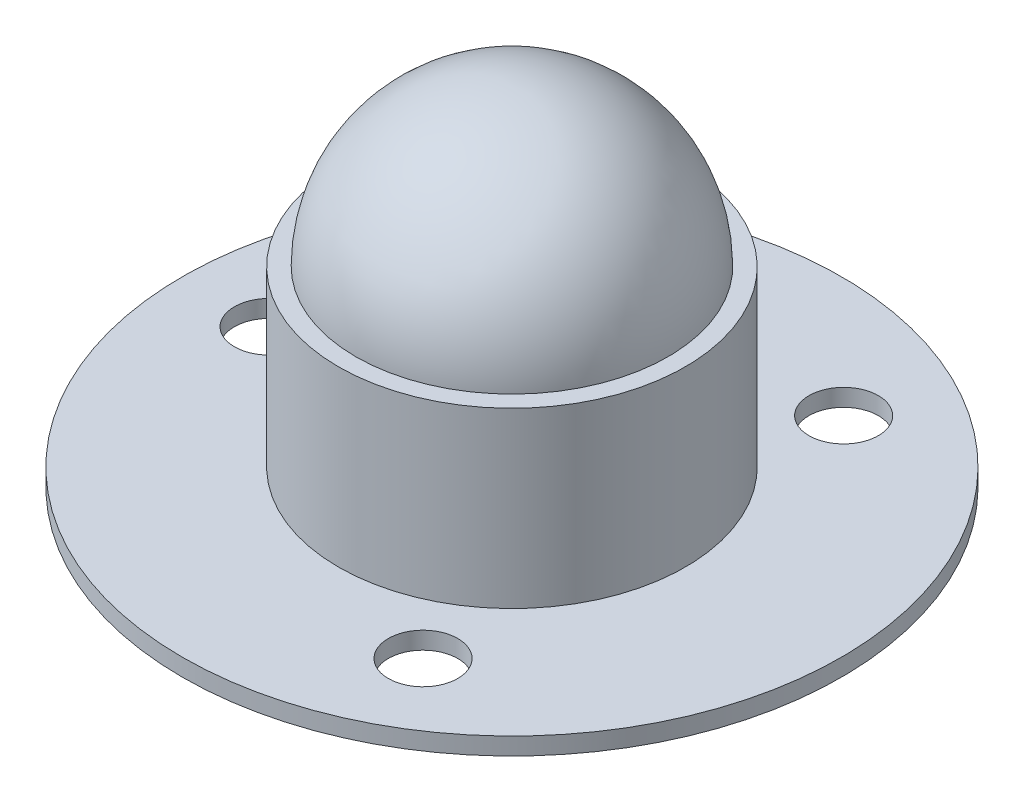
ISO-10303-21;
HEADER;
FILE_DESCRIPTION(('STEP AP214'),'2;1');
FILE_NAME('part.step','',(''),(''),'','','');
FILE_SCHEMA(('AUTOMOTIVE_DESIGN { 1 0 10303 214 1 1 1 1 }'));
ENDSEC;
DATA;
#1=APPLICATION_CONTEXT('core data for automotive mechanical design processes');
#2=APPLICATION_PROTOCOL_DEFINITION('international standard','automotive_design',2000,#1);
#3=PRODUCT_CONTEXT('',#1,'mechanical');
#4=PRODUCT('Part','Part','',(#3));
#5=PRODUCT_RELATED_PRODUCT_CATEGORY('part','',(#4));
#6=PRODUCT_DEFINITION_FORMATION('','',#4);
#7=PRODUCT_DEFINITION_CONTEXT('part definition',#1,'design');
#8=PRODUCT_DEFINITION('design','',#6,#7);
#9=PRODUCT_DEFINITION_SHAPE('','',#8);
#10=(LENGTH_UNIT() NAMED_UNIT(*) SI_UNIT(.MILLI.,.METRE.));
#11=(NAMED_UNIT(*) PLANE_ANGLE_UNIT() SI_UNIT($,.RADIAN.));
#12=(NAMED_UNIT(*) SI_UNIT($,.STERADIAN.) SOLID_ANGLE_UNIT());
#13=UNCERTAINTY_MEASURE_WITH_UNIT(LENGTH_MEASURE(1.E-05),#10,'distance_accuracy_value','');
#14=(GEOMETRIC_REPRESENTATION_CONTEXT(3) GLOBAL_UNCERTAINTY_ASSIGNED_CONTEXT((#13)) GLOBAL_UNIT_ASSIGNED_CONTEXT((#10,
#11,#12)) REPRESENTATION_CONTEXT('',''));
#15=CARTESIAN_POINT('',(0.,0.,0.));
#16=DIRECTION('',(0.,0.,1.));
#17=DIRECTION('',(1.,0.,0.));
#18=AXIS2_PLACEMENT_3D('',#15,#16,#17);
#19=CARTESIAN_POINT('',(7.,0.5,-12.1243556529821));
#20=DIRECTION('',(0.,-1.,0.));
#21=DIRECTION('',(0.,0.,-1.));
#22=AXIS2_PLACEMENT_3D('',#19,#20,#21);
#23=CYLINDRICAL_SURFACE('',#22,2.00000000000001);
#24=CARTESIAN_POINT('',(7.,0.5,-12.1243556529821));
#25=DIRECTION('',(0.,1.,0.));
#26=DIRECTION('',(0.,0.,1.));
#27=AXIS2_PLACEMENT_3D('',#24,#25,#26);
#28=CIRCLE('',#27,2.00000000000001);
#29=CARTESIAN_POINT('',(7.,0.5,-10.1243556529821));
#30=VERTEX_POINT('',#29);
#31=EDGE_CURVE('E52',#30,#30,#28,.T.);
#32=ORIENTED_EDGE('',*,*,#31,.T.);
#33=EDGE_LOOP('',(#32));
#34=FACE_BOUND('',#33,.T.);
#35=CARTESIAN_POINT('',(7.,-0.5,-12.1243556529821));
#36=DIRECTION('',(0.,1.,0.));
#37=DIRECTION('',(0.,0.,1.));
#38=AXIS2_PLACEMENT_3D('',#35,#36,#37);
#39=CIRCLE('',#38,2.00000000000001);
#40=CARTESIAN_POINT('',(7.,-0.5,-10.1243556529821));
#41=VERTEX_POINT('',#40);
#42=EDGE_CURVE('E71',#41,#41,#39,.T.);
#43=ORIENTED_EDGE('',*,*,#42,.F.);
#44=EDGE_LOOP('',(#43));
#45=FACE_BOUND('',#44,.T.);
#46=ADVANCED_FACE('F39',(#34,#45),#23,.F.);
#47=CARTESIAN_POINT('',(7.00000000000001,0.5,12.1243556529821));
#48=DIRECTION('',(0.,-1.,0.));
#49=DIRECTION('',(0.,0.,-1.));
#50=AXIS2_PLACEMENT_3D('',#47,#48,#49);
#51=CYLINDRICAL_SURFACE('',#50,2.);
#52=CARTESIAN_POINT('',(7.00000000000001,0.5,12.1243556529821));
#53=DIRECTION('',(0.,1.,0.));
#54=DIRECTION('',(0.,0.,1.));
#55=AXIS2_PLACEMENT_3D('',#52,#53,#54);
#56=CIRCLE('',#55,2.);
#57=CARTESIAN_POINT('',(7.00000000000001,0.5,14.1243556529821));
#58=VERTEX_POINT('',#57);
#59=EDGE_CURVE('E58',#58,#58,#56,.T.);
#60=ORIENTED_EDGE('',*,*,#59,.T.);
#61=EDGE_LOOP('',(#60));
#62=FACE_BOUND('',#61,.T.);
#63=CARTESIAN_POINT('',(7.00000000000001,-0.5,12.1243556529821));
#64=DIRECTION('',(0.,1.,0.));
#65=DIRECTION('',(0.,0.,1.));
#66=AXIS2_PLACEMENT_3D('',#63,#64,#65);
#67=CIRCLE('',#66,2.);
#68=CARTESIAN_POINT('',(7.00000000000001,-0.5,14.1243556529821));
#69=VERTEX_POINT('',#68);
#70=EDGE_CURVE('E66',#69,#69,#67,.T.);
#71=ORIENTED_EDGE('',*,*,#70,.F.);
#72=EDGE_LOOP('',(#71));
#73=FACE_BOUND('',#72,.T.);
#74=ADVANCED_FACE('F117',(#62,#73),#51,.F.);
#75=CARTESIAN_POINT('',(-14.,0.5,0.));
#76=DIRECTION('',(0.,-1.,0.));
#77=DIRECTION('',(0.,0.,-1.));
#78=AXIS2_PLACEMENT_3D('',#75,#76,#77);
#79=CYLINDRICAL_SURFACE('',#78,2.);
#80=CARTESIAN_POINT('',(-14.,0.5,0.));
#81=DIRECTION('',(0.,1.,0.));
#82=DIRECTION('',(0.,0.,1.));
#83=AXIS2_PLACEMENT_3D('',#80,#81,#82);
#84=CIRCLE('',#83,2.);
#85=CARTESIAN_POINT('',(-14.,0.5,2.));
#86=VERTEX_POINT('',#85);
#87=EDGE_CURVE('E77',#86,#86,#84,.T.);
#88=ORIENTED_EDGE('',*,*,#87,.T.);
#89=EDGE_LOOP('',(#88));
#90=FACE_BOUND('',#89,.T.);
#91=CARTESIAN_POINT('',(-14.,-0.5,0.));
#92=DIRECTION('',(0.,1.,0.));
#93=DIRECTION('',(0.,0.,1.));
#94=AXIS2_PLACEMENT_3D('',#91,#92,#93);
#95=CIRCLE('',#94,2.);
#96=CARTESIAN_POINT('',(-14.,-0.5,2.));
#97=VERTEX_POINT('',#96);
#98=EDGE_CURVE('E62',#97,#97,#95,.T.);
#99=ORIENTED_EDGE('',*,*,#98,.F.);
#100=EDGE_LOOP('',(#99));
#101=FACE_BOUND('',#100,.T.);
#102=ADVANCED_FACE('F41',(#90,#101),#79,.F.);
#103=CARTESIAN_POINT('',(0.,0.5,0.));
#104=DIRECTION('',(0.,-1.,0.));
#105=DIRECTION('',(0.,0.,-1.));
#106=AXIS2_PLACEMENT_3D('',#103,#104,#105);
#107=CYLINDRICAL_SURFACE('',#106,19.);
#108=CARTESIAN_POINT('',(0.,0.5,0.));
#109=DIRECTION('',(0.,1.,0.));
#110=DIRECTION('',(0.,0.,1.));
#111=AXIS2_PLACEMENT_3D('',#108,#109,#110);
#112=CIRCLE('',#111,19.);
#113=CARTESIAN_POINT('',(0.,0.5,19.));
#114=VERTEX_POINT('',#113);
#115=EDGE_CURVE('E47',#114,#114,#112,.T.);
#116=ORIENTED_EDGE('',*,*,#115,.F.);
#117=EDGE_LOOP('',(#116));
#118=FACE_BOUND('',#117,.T.);
#119=CARTESIAN_POINT('',(0.,-0.5,0.));
#120=DIRECTION('',(0.,1.,0.));
#121=DIRECTION('',(0.,0.,1.));
#122=AXIS2_PLACEMENT_3D('',#119,#120,#121);
#123=CIRCLE('',#122,19.);
#124=CARTESIAN_POINT('',(0.,-0.5,19.));
#125=VERTEX_POINT('',#124);
#126=EDGE_CURVE('E74',#125,#125,#123,.T.);
#127=ORIENTED_EDGE('',*,*,#126,.T.);
#128=EDGE_LOOP('',(#127));
#129=FACE_BOUND('',#128,.T.);
#130=ADVANCED_FACE('F108',(#118,#129),#107,.T.);
#131=CARTESIAN_POINT('',(0.,0.5,0.));
#132=DIRECTION('',(0.,1.,0.));
#133=DIRECTION('',(0.,0.,1.));
#134=AXIS2_PLACEMENT_3D('',#131,#132,#133);
#135=PLANE('',#134);
#136=CARTESIAN_POINT('',(0.,0.5,0.));
#137=DIRECTION('',(0.,1.,0.));
#138=DIRECTION('',(0.,0.,1.));
#139=AXIS2_PLACEMENT_3D('',#136,#137,#138);
#140=CIRCLE('',#139,10.);
#141=CARTESIAN_POINT('',(0.,0.5,10.));
#142=VERTEX_POINT('',#141);
#143=EDGE_CURVE('E88',#142,#142,#140,.T.);
#144=ORIENTED_EDGE('',*,*,#143,.F.);
#145=EDGE_LOOP('',(#144));
#146=FACE_BOUND('',#145,.T.);
#147=ORIENTED_EDGE('',*,*,#87,.F.);
#148=EDGE_LOOP('',(#147));
#149=FACE_BOUND('',#148,.T.);
#150=ORIENTED_EDGE('',*,*,#59,.F.);
#151=EDGE_LOOP('',(#150));
#152=FACE_BOUND('',#151,.T.);
#153=ORIENTED_EDGE('',*,*,#31,.F.);
#154=EDGE_LOOP('',(#153));
#155=FACE_BOUND('',#154,.T.);
#156=ORIENTED_EDGE('',*,*,#115,.T.);
#157=EDGE_LOOP('',(#156));
#158=FACE_BOUND('',#157,.T.);
#159=ADVANCED_FACE('F105',(#146,#149,#152,#155,#158),#135,.T.);
#160=CARTESIAN_POINT('',(0.,-0.5,0.));
#161=DIRECTION('',(0.,1.,0.));
#162=DIRECTION('',(0.,0.,1.));
#163=AXIS2_PLACEMENT_3D('',#160,#161,#162);
#164=PLANE('',#163);
#165=ORIENTED_EDGE('',*,*,#98,.T.);
#166=EDGE_LOOP('',(#165));
#167=FACE_BOUND('',#166,.T.);
#168=ORIENTED_EDGE('',*,*,#70,.T.);
#169=EDGE_LOOP('',(#168));
#170=FACE_BOUND('',#169,.T.);
#171=ORIENTED_EDGE('',*,*,#42,.T.);
#172=EDGE_LOOP('',(#171));
#173=FACE_BOUND('',#172,.T.);
#174=ORIENTED_EDGE('',*,*,#126,.F.);
#175=EDGE_LOOP('',(#174));
#176=FACE_BOUND('',#175,.T.);
#177=ADVANCED_FACE('F101',(#167,#170,#173,#176),#164,.F.);
#178=CARTESIAN_POINT('',(0.,10.5,0.));
#179=DIRECTION('',(0.,-1.,0.));
#180=DIRECTION('',(0.,0.,-1.));
#181=AXIS2_PLACEMENT_3D('',#178,#179,#180);
#182=CYLINDRICAL_SURFACE('',#181,10.);
#183=CARTESIAN_POINT('',(0.,10.5,0.));
#184=DIRECTION('',(0.,1.,0.));
#185=DIRECTION('',(0.,0.,1.));
#186=AXIS2_PLACEMENT_3D('',#183,#184,#185);
#187=CIRCLE('',#186,10.);
#188=CARTESIAN_POINT('',(0.,10.5,10.));
#189=VERTEX_POINT('',#188);
#190=EDGE_CURVE('E67',#189,#189,#187,.T.);
#191=ORIENTED_EDGE('',*,*,#190,.F.);
#192=EDGE_LOOP('',(#191));
#193=FACE_BOUND('',#192,.T.);
#194=ORIENTED_EDGE('',*,*,#143,.T.);
#195=EDGE_LOOP('',(#194));
#196=FACE_BOUND('',#195,.T.);
#197=ADVANCED_FACE('F98',(#193,#196),#182,.T.);
#198=CARTESIAN_POINT('',(0.,10.5,0.));
#199=DIRECTION('',(0.,1.,0.));
#200=DIRECTION('',(0.,0.,1.));
#201=AXIS2_PLACEMENT_3D('',#198,#199,#200);
#202=PLANE('',#201);
#203=CARTESIAN_POINT('',(0.,10.5,0.));
#204=DIRECTION('',(0.,1.,0.));
#205=DIRECTION('',(0.,0.,1.));
#206=AXIS2_PLACEMENT_3D('',#203,#204,#205);
#207=CIRCLE('',#206,9.);
#208=CARTESIAN_POINT('',(0.,10.5,9.));
#209=VERTEX_POINT('',#208);
#210=EDGE_CURVE('E10',#209,#209,#207,.T.);
#211=ORIENTED_EDGE('',*,*,#210,.F.);
#212=EDGE_LOOP('',(#211));
#213=FACE_BOUND('',#212,.T.);
#214=ORIENTED_EDGE('',*,*,#190,.T.);
#215=EDGE_LOOP('',(#214));
#216=FACE_BOUND('',#215,.T.);
#217=ADVANCED_FACE('F96',(#213,#216),#202,.T.);
#218=CARTESIAN_POINT('',(0.,10.5,0.));
#219=DIRECTION('',(0.,0.,-1.));
#220=DIRECTION('',(1.,0.,0.));
#221=AXIS2_PLACEMENT_3D('',#218,#219,#220);
#222=SPHERICAL_SURFACE('',#221,9.);
#223=CARTESIAN_POINT('',(0.,10.5,0.));
#224=DIRECTION('',(0.,1.,0.));
#225=DIRECTION('',(0.,0.,1.));
#226=AXIS2_PLACEMENT_3D('',#223,#224,#225);
#227=SPHERICAL_SURFACE('',#226,9.);
#228=ORIENTED_EDGE('',*,*,#210,.T.);
#229=EDGE_LOOP('',(#228));
#230=FACE_BOUND('',#229,.T.);
#231=ADVANCED_FACE('F167',(#230),#227,.T.);
#232=CLOSED_SHELL('',(#46,#74,#102,#130,#159,#177,#197,#217,#231));
#233=MANIFOLD_SOLID_BREP('B2',#232);
#234=ADVANCED_BREP_SHAPE_REPRESENTATION('',(#18,#233),#14);
#235=SHAPE_DEFINITION_REPRESENTATION(#9,#234);
ENDSEC;
END-ISO-10303-21;
